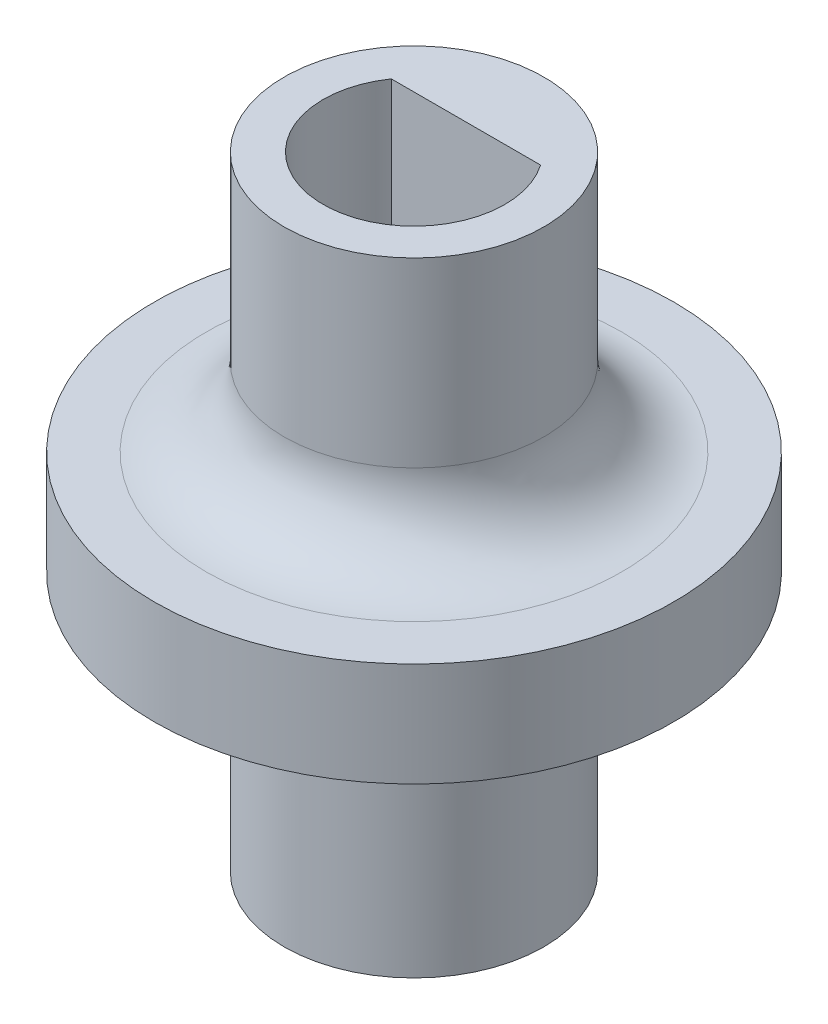
ISO-10303-21;
HEADER;
FILE_DESCRIPTION(('STEP AP214'),'2;1');
FILE_NAME('part.step','',(''),(''),'','','');
FILE_SCHEMA(('AUTOMOTIVE_DESIGN { 1 0 10303 214 1 1 1 1 }'));
ENDSEC;
DATA;
#1=APPLICATION_CONTEXT('core data for automotive mechanical design processes');
#2=APPLICATION_PROTOCOL_DEFINITION('international standard','automotive_design',2000,#1);
#3=PRODUCT_CONTEXT('',#1,'mechanical');
#4=PRODUCT('Part','Part','',(#3));
#5=PRODUCT_RELATED_PRODUCT_CATEGORY('part','',(#4));
#6=PRODUCT_DEFINITION_FORMATION('','',#4);
#7=PRODUCT_DEFINITION_CONTEXT('part definition',#1,'design');
#8=PRODUCT_DEFINITION('design','',#6,#7);
#9=PRODUCT_DEFINITION_SHAPE('','',#8);
#10=(LENGTH_UNIT() NAMED_UNIT(*) SI_UNIT(.MILLI.,.METRE.));
#11=(NAMED_UNIT(*) PLANE_ANGLE_UNIT() SI_UNIT($,.RADIAN.));
#12=(NAMED_UNIT(*) SI_UNIT($,.STERADIAN.) SOLID_ANGLE_UNIT());
#13=UNCERTAINTY_MEASURE_WITH_UNIT(LENGTH_MEASURE(1.E-05),#10,'distance_accuracy_value','');
#14=(GEOMETRIC_REPRESENTATION_CONTEXT(3) GLOBAL_UNCERTAINTY_ASSIGNED_CONTEXT((#13)) GLOBAL_UNIT_ASSIGNED_CONTEXT((#10,
#11,#12)) REPRESENTATION_CONTEXT('',''));
#15=CARTESIAN_POINT('',(0.,0.,0.));
#16=DIRECTION('',(0.,0.,1.));
#17=DIRECTION('',(1.,0.,0.));
#18=AXIS2_PLACEMENT_3D('',#15,#16,#17);
#19=CARTESIAN_POINT('',(0.,2.,0.));
#20=DIRECTION('',(0.,-1.,0.));
#21=DIRECTION('',(0.,0.,-1.));
#22=AXIS2_PLACEMENT_3D('',#19,#20,#21);
#23=CYLINDRICAL_SURFACE('',#22,10.);
#24=CARTESIAN_POINT('',(0.,2.,0.));
#25=DIRECTION('',(0.,1.,0.));
#26=DIRECTION('',(0.,0.,1.));
#27=AXIS2_PLACEMENT_3D('',#24,#25,#26);
#28=CIRCLE('',#27,10.);
#29=CARTESIAN_POINT('',(0.,2.,10.));
#30=VERTEX_POINT('',#29);
#31=EDGE_CURVE('E147',#30,#30,#28,.T.);
#32=ORIENTED_EDGE('',*,*,#31,.F.);
#33=EDGE_LOOP('',(#32));
#34=FACE_BOUND('',#33,.T.);
#35=CARTESIAN_POINT('',(0.,-2.,0.));
#36=DIRECTION('',(0.,1.,0.));
#37=DIRECTION('',(0.,0.,1.));
#38=AXIS2_PLACEMENT_3D('',#35,#36,#37);
#39=CIRCLE('',#38,10.);
#40=CARTESIAN_POINT('',(0.,-2.,10.));
#41=VERTEX_POINT('',#40);
#42=EDGE_CURVE('E146',#41,#41,#39,.T.);
#43=ORIENTED_EDGE('',*,*,#42,.T.);
#44=EDGE_LOOP('',(#43));
#45=FACE_BOUND('',#44,.T.);
#46=ADVANCED_FACE('F35',(#34,#45),#23,.T.);
#47=CARTESIAN_POINT('',(0.,2.,0.));
#48=DIRECTION('',(0.,1.,0.));
#49=DIRECTION('',(0.,0.,1.));
#50=AXIS2_PLACEMENT_3D('',#47,#48,#49);
#51=PLANE('',#50);
#52=CARTESIAN_POINT('',(0.,2.,0.));
#53=DIRECTION('',(0.,1.,0.));
#54=DIRECTION('',(0.,0.,1.));
#55=AXIS2_PLACEMENT_3D('',#52,#53,#54);
#56=CIRCLE('',#55,8.);
#57=CARTESIAN_POINT('',(0.,2.,8.));
#58=VERTEX_POINT('',#57);
#59=EDGE_CURVE('E11',#58,#58,#56,.F.);
#60=ORIENTED_EDGE('',*,*,#59,.T.);
#61=EDGE_LOOP('',(#60));
#62=FACE_BOUND('',#61,.T.);
#63=ORIENTED_EDGE('',*,*,#31,.T.);
#64=EDGE_LOOP('',(#63));
#65=FACE_BOUND('',#64,.T.);
#66=ADVANCED_FACE('F176',(#62,#65),#51,.T.);
#67=CARTESIAN_POINT('',(0.,-2.,0.));
#68=DIRECTION('',(0.,1.,0.));
#69=DIRECTION('',(0.,0.,1.));
#70=AXIS2_PLACEMENT_3D('',#67,#68,#69);
#71=PLANE('',#70);
#72=CARTESIAN_POINT('',(0.,-2.,0.));
#73=DIRECTION('',(0.,1.,0.));
#74=DIRECTION('',(0.,0.,1.));
#75=AXIS2_PLACEMENT_3D('',#72,#73,#74);
#76=CIRCLE('',#75,8.);
#77=CARTESIAN_POINT('',(0.,-2.,8.));
#78=VERTEX_POINT('',#77);
#79=EDGE_CURVE('E155',#78,#78,#76,.T.);
#80=ORIENTED_EDGE('',*,*,#79,.T.);
#81=EDGE_LOOP('',(#80));
#82=FACE_BOUND('',#81,.T.);
#83=ORIENTED_EDGE('',*,*,#42,.F.);
#84=EDGE_LOOP('',(#83));
#85=FACE_BOUND('',#84,.T.);
#86=ADVANCED_FACE('F182',(#82,#85),#71,.F.);
#87=CARTESIAN_POINT('',(0.,12.,0.));
#88=DIRECTION('',(0.,-1.,0.));
#89=DIRECTION('',(0.,0.,-1.));
#90=AXIS2_PLACEMENT_3D('',#87,#88,#89);
#91=CYLINDRICAL_SURFACE('',#90,5.);
#92=CARTESIAN_POINT('',(0.,5.,0.));
#93=DIRECTION('',(0.,1.,0.));
#94=DIRECTION('',(0.,0.,1.));
#95=AXIS2_PLACEMENT_3D('',#92,#93,#94);
#96=CIRCLE('',#95,5.);
#97=CARTESIAN_POINT('',(0.,5.,5.));
#98=VERTEX_POINT('',#97);
#99=EDGE_CURVE('E43',#98,#98,#96,.T.);
#100=ORIENTED_EDGE('',*,*,#99,.T.);
#101=EDGE_LOOP('',(#100));
#102=FACE_BOUND('',#101,.T.);
#103=CARTESIAN_POINT('',(0.,12.,0.));
#104=DIRECTION('',(0.,1.,0.));
#105=DIRECTION('',(0.,0.,1.));
#106=AXIS2_PLACEMENT_3D('',#103,#104,#105);
#107=CIRCLE('',#106,5.);
#108=CARTESIAN_POINT('',(0.,12.,5.));
#109=VERTEX_POINT('',#108);
#110=EDGE_CURVE('E142',#109,#109,#107,.T.);
#111=ORIENTED_EDGE('',*,*,#110,.F.);
#112=EDGE_LOOP('',(#111));
#113=FACE_BOUND('',#112,.T.);
#114=ADVANCED_FACE('F160',(#102,#113),#91,.T.);
#115=CARTESIAN_POINT('',(0.,12.,0.));
#116=DIRECTION('',(0.,1.,0.));
#117=DIRECTION('',(0.,0.,1.));
#118=AXIS2_PLACEMENT_3D('',#115,#116,#117);
#119=PLANE('',#118);
#120=CARTESIAN_POINT('',(0.,12.,0.));
#121=DIRECTION('',(0.,1.,0.));
#122=DIRECTION('',(0.,0.,1.));
#123=AXIS2_PLACEMENT_3D('',#120,#121,#122);
#124=CIRCLE('',#123,3.5);
#125=CARTESIAN_POINT('',(-2.87228132326901,12.,-2.));
#126=VERTEX_POINT('',#125);
#127=CARTESIAN_POINT('',(2.87228132326901,12.,-2.));
#128=VERTEX_POINT('',#127);
#129=EDGE_CURVE('E58',#126,#128,#124,.T.);
#130=ORIENTED_EDGE('',*,*,#129,.F.);
#131=DIRECTION('',(-1.,0.,0.));
#132=VECTOR('',#131,1.);
#133=CARTESIAN_POINT('',(-2.87228132326901,12.,-2.));
#134=LINE('',#133,#132);
#135=EDGE_CURVE('E133',#128,#126,#134,.T.);
#136=ORIENTED_EDGE('',*,*,#135,.F.);
#137=EDGE_LOOP('',(#130,#136));
#138=FACE_BOUND('',#137,.T.);
#139=ORIENTED_EDGE('',*,*,#110,.T.);
#140=EDGE_LOOP('',(#139));
#141=FACE_BOUND('',#140,.T.);
#142=ADVANCED_FACE('F193',(#138,#141),#119,.T.);
#143=CARTESIAN_POINT('',(0.,4.,0.));
#144=DIRECTION('',(0.,1.,0.));
#145=DIRECTION('',(0.,0.,1.));
#146=AXIS2_PLACEMENT_3D('',#143,#144,#145);
#147=CYLINDRICAL_SURFACE('',#146,3.5);
#148=ORIENTED_EDGE('',*,*,#129,.T.);
#149=DIRECTION('',(0.,1.,0.));
#150=VECTOR('',#149,1.);
#151=CARTESIAN_POINT('',(2.87228132326901,4.,-2.));
#152=LINE('',#151,#150);
#153=CARTESIAN_POINT('',(2.87228132326901,4.,-2.));
#154=VERTEX_POINT('',#153);
#155=EDGE_CURVE('E136',#154,#128,#152,.T.);
#156=ORIENTED_EDGE('',*,*,#155,.F.);
#157=CARTESIAN_POINT('',(0.,4.,0.));
#158=DIRECTION('',(0.,1.,0.));
#159=DIRECTION('',(0.,0.,1.));
#160=AXIS2_PLACEMENT_3D('',#157,#158,#159);
#161=CIRCLE('',#160,3.5);
#162=CARTESIAN_POINT('',(-2.87228132326901,4.,-2.));
#163=VERTEX_POINT('',#162);
#164=EDGE_CURVE('E129',#163,#154,#161,.T.);
#165=ORIENTED_EDGE('',*,*,#164,.F.);
#166=DIRECTION('',(0.,1.,0.));
#167=VECTOR('',#166,1.);
#168=CARTESIAN_POINT('',(-2.87228132326901,4.,-2.));
#169=LINE('',#168,#167);
#170=EDGE_CURVE('E140',#163,#126,#169,.T.);
#171=ORIENTED_EDGE('',*,*,#170,.T.);
#172=EDGE_LOOP('',(#148,#156,#165,#171));
#173=FACE_BOUND('',#172,.T.);
#174=ADVANCED_FACE('F196',(#173),#147,.F.);
#175=CARTESIAN_POINT('',(-2.87228132326901,4.,-2.));
#176=DIRECTION('',(0.,0.,-1.));
#177=DIRECTION('',(-1.,0.,0.));
#178=AXIS2_PLACEMENT_3D('',#175,#176,#177);
#179=PLANE('',#178);
#180=ORIENTED_EDGE('',*,*,#135,.T.);
#181=ORIENTED_EDGE('',*,*,#170,.F.);
#182=DIRECTION('',(-1.,0.,0.));
#183=VECTOR('',#182,1.);
#184=CARTESIAN_POINT('',(-2.87228132326901,4.,-2.));
#185=LINE('',#184,#183);
#186=EDGE_CURVE('E132',#154,#163,#185,.T.);
#187=ORIENTED_EDGE('',*,*,#186,.F.);
#188=ORIENTED_EDGE('',*,*,#155,.T.);
#189=EDGE_LOOP('',(#180,#181,#187,#188));
#190=FACE_BOUND('',#189,.T.);
#191=ADVANCED_FACE('F200',(#190),#179,.F.);
#192=CARTESIAN_POINT('',(0.,4.,0.));
#193=DIRECTION('',(0.,1.,0.));
#194=DIRECTION('',(0.,0.,1.));
#195=AXIS2_PLACEMENT_3D('',#192,#193,#194);
#196=PLANE('',#195);
#197=ORIENTED_EDGE('',*,*,#164,.T.);
#198=ORIENTED_EDGE('',*,*,#186,.T.);
#199=EDGE_LOOP('',(#197,#198));
#200=FACE_BOUND('',#199,.T.);
#201=ADVANCED_FACE('F203',(#200),#196,.T.);
#202=CARTESIAN_POINT('',(0.,-12.,0.));
#203=DIRECTION('',(0.,1.,0.));
#204=DIRECTION('',(0.,0.,1.));
#205=AXIS2_PLACEMENT_3D('',#202,#203,#204);
#206=CYLINDRICAL_SURFACE('',#205,5.);
#207=CARTESIAN_POINT('',(0.,-5.,0.));
#208=DIRECTION('',(0.,1.,0.));
#209=DIRECTION('',(0.,0.,1.));
#210=AXIS2_PLACEMENT_3D('',#207,#208,#209);
#211=CIRCLE('',#210,5.);
#212=CARTESIAN_POINT('',(0.,-5.,5.));
#213=VERTEX_POINT('',#212);
#214=EDGE_CURVE('E150',#213,#213,#211,.F.);
#215=ORIENTED_EDGE('',*,*,#214,.T.);
#216=EDGE_LOOP('',(#215));
#217=FACE_BOUND('',#216,.T.);
#218=CARTESIAN_POINT('',(0.,-12.,0.));
#219=DIRECTION('',(0.,-1.,0.));
#220=DIRECTION('',(0.,0.,-1.));
#221=AXIS2_PLACEMENT_3D('',#218,#219,#220);
#222=CIRCLE('',#221,5.);
#223=CARTESIAN_POINT('',(0.,-12.,-5.));
#224=VERTEX_POINT('',#223);
#225=EDGE_CURVE('E123',#224,#224,#222,.T.);
#226=ORIENTED_EDGE('',*,*,#225,.F.);
#227=EDGE_LOOP('',(#226));
#228=FACE_BOUND('',#227,.T.);
#229=ADVANCED_FACE('F207',(#217,#228),#206,.T.);
#230=CARTESIAN_POINT('',(0.,-12.,0.));
#231=DIRECTION('',(0.,-1.,0.));
#232=DIRECTION('',(0.,0.,-1.));
#233=AXIS2_PLACEMENT_3D('',#230,#231,#232);
#234=PLANE('',#233);
#235=CARTESIAN_POINT('',(0.,-12.,0.));
#236=DIRECTION('',(0.,-1.,0.));
#237=DIRECTION('',(0.,0.,-1.));
#238=AXIS2_PLACEMENT_3D('',#235,#236,#237);
#239=CIRCLE('',#238,3.25);
#240=CARTESIAN_POINT('',(-2.19146070008111,-12.,2.4));
#241=VERTEX_POINT('',#240);
#242=CARTESIAN_POINT('',(-2.19146070008111,-12.,-2.4));
#243=VERTEX_POINT('',#242);
#244=EDGE_CURVE('E50',#241,#243,#239,.T.);
#245=ORIENTED_EDGE('',*,*,#244,.F.);
#246=DIRECTION('',(-1.,0.,0.));
#247=VECTOR('',#246,1.);
#248=CARTESIAN_POINT('',(-2.19146070008111,-12.,2.4));
#249=LINE('',#248,#247);
#250=CARTESIAN_POINT('',(2.19146070008111,-12.,2.4));
#251=VERTEX_POINT('',#250);
#252=EDGE_CURVE('E108',#251,#241,#249,.T.);
#253=ORIENTED_EDGE('',*,*,#252,.F.);
#254=CARTESIAN_POINT('',(0.,-12.,0.));
#255=DIRECTION('',(0.,-1.,0.));
#256=DIRECTION('',(0.,0.,-1.));
#257=AXIS2_PLACEMENT_3D('',#254,#255,#256);
#258=CIRCLE('',#257,3.25);
#259=CARTESIAN_POINT('',(2.19146070008111,-12.,-2.4));
#260=VERTEX_POINT('',#259);
#261=EDGE_CURVE('E111',#260,#251,#258,.T.);
#262=ORIENTED_EDGE('',*,*,#261,.F.);
#263=DIRECTION('',(1.,0.,0.));
#264=VECTOR('',#263,1.);
#265=CARTESIAN_POINT('',(-2.19146070008111,-12.,-2.4));
#266=LINE('',#265,#264);
#267=EDGE_CURVE('E117',#243,#260,#266,.T.);
#268=ORIENTED_EDGE('',*,*,#267,.F.);
#269=EDGE_LOOP('',(#245,#253,#262,#268));
#270=FACE_BOUND('',#269,.T.);
#271=ORIENTED_EDGE('',*,*,#225,.T.);
#272=EDGE_LOOP('',(#271));
#273=FACE_BOUND('',#272,.T.);
#274=ADVANCED_FACE('F172',(#270,#273),#234,.T.);
#275=CARTESIAN_POINT('',(0.,-5.,0.));
#276=DIRECTION('',(0.,1.,0.));
#277=DIRECTION('',(0.,0.,1.));
#278=AXIS2_PLACEMENT_3D('',#275,#276,#277);
#279=TOROIDAL_SURFACE('',#278,8.,3.);
#280=ORIENTED_EDGE('',*,*,#79,.F.);
#281=EDGE_LOOP('',(#280));
#282=FACE_BOUND('',#281,.T.);
#283=ORIENTED_EDGE('',*,*,#214,.F.);
#284=EDGE_LOOP('',(#283));
#285=FACE_BOUND('',#284,.T.);
#286=ADVANCED_FACE('F164',(#282,#285),#279,.F.);
#287=CARTESIAN_POINT('',(0.,5.,0.));
#288=DIRECTION('',(0.,1.,0.));
#289=DIRECTION('',(0.,0.,1.));
#290=AXIS2_PLACEMENT_3D('',#287,#288,#289);
#291=TOROIDAL_SURFACE('',#290,8.,3.);
#292=ORIENTED_EDGE('',*,*,#59,.F.);
#293=EDGE_LOOP('',(#292));
#294=FACE_BOUND('',#293,.T.);
#295=ORIENTED_EDGE('',*,*,#99,.F.);
#296=EDGE_LOOP('',(#295));
#297=FACE_BOUND('',#296,.T.);
#298=ADVANCED_FACE('F37',(#294,#297),#291,.F.);
#299=CARTESIAN_POINT('',(0.,-3.,0.));
#300=DIRECTION('',(0.,-1.,0.));
#301=DIRECTION('',(0.,0.,-1.));
#302=AXIS2_PLACEMENT_3D('',#299,#300,#301);
#303=CYLINDRICAL_SURFACE('',#302,3.25);
#304=ORIENTED_EDGE('',*,*,#244,.T.);
#305=DIRECTION('',(0.,-1.,0.));
#306=VECTOR('',#305,1.);
#307=CARTESIAN_POINT('',(-2.19146070008111,-3.,-2.4));
#308=LINE('',#307,#306);
#309=CARTESIAN_POINT('',(-2.19146070008111,-3.,-2.4));
#310=VERTEX_POINT('',#309);
#311=EDGE_CURVE('E86',#310,#243,#308,.T.);
#312=ORIENTED_EDGE('',*,*,#311,.F.);
#313=CARTESIAN_POINT('',(0.,-3.,0.));
#314=DIRECTION('',(0.,-1.,0.));
#315=DIRECTION('',(0.,0.,-1.));
#316=AXIS2_PLACEMENT_3D('',#313,#314,#315);
#317=CIRCLE('',#316,3.25);
#318=CARTESIAN_POINT('',(-2.19146070008111,-3.,2.4));
#319=VERTEX_POINT('',#318);
#320=EDGE_CURVE('E90',#319,#310,#317,.T.);
#321=ORIENTED_EDGE('',*,*,#320,.F.);
#322=DIRECTION('',(0.,-1.,0.));
#323=VECTOR('',#322,1.);
#324=CARTESIAN_POINT('',(-2.19146070008111,-3.,2.4));
#325=LINE('',#324,#323);
#326=EDGE_CURVE('E121',#319,#241,#325,.T.);
#327=ORIENTED_EDGE('',*,*,#326,.T.);
#328=EDGE_LOOP('',(#304,#312,#321,#327));
#329=FACE_BOUND('',#328,.T.);
#330=ADVANCED_FACE('F88',(#329),#303,.F.);
#331=CARTESIAN_POINT('',(-2.19146070008111,-3.,2.4));
#332=DIRECTION('',(0.,0.,1.));
#333=DIRECTION('',(1.,0.,0.));
#334=AXIS2_PLACEMENT_3D('',#331,#332,#333);
#335=PLANE('',#334);
#336=ORIENTED_EDGE('',*,*,#252,.T.);
#337=ORIENTED_EDGE('',*,*,#326,.F.);
#338=DIRECTION('',(-1.,0.,0.));
#339=VECTOR('',#338,1.);
#340=CARTESIAN_POINT('',(-2.19146070008111,-3.,2.4));
#341=LINE('',#340,#339);
#342=CARTESIAN_POINT('',(2.19146070008111,-3.,2.4));
#343=VERTEX_POINT('',#342);
#344=EDGE_CURVE('E96',#343,#319,#341,.T.);
#345=ORIENTED_EDGE('',*,*,#344,.F.);
#346=DIRECTION('',(0.,-1.,0.));
#347=VECTOR('',#346,1.);
#348=CARTESIAN_POINT('',(2.19146070008111,-3.,2.4));
#349=LINE('',#348,#347);
#350=EDGE_CURVE('E124',#343,#251,#349,.T.);
#351=ORIENTED_EDGE('',*,*,#350,.T.);
#352=EDGE_LOOP('',(#336,#337,#345,#351));
#353=FACE_BOUND('',#352,.T.);
#354=ADVANCED_FACE('F170',(#353),#335,.F.);
#355=CARTESIAN_POINT('',(0.,-3.,0.));
#356=DIRECTION('',(0.,-1.,0.));
#357=DIRECTION('',(0.,0.,-1.));
#358=AXIS2_PLACEMENT_3D('',#355,#356,#357);
#359=CYLINDRICAL_SURFACE('',#358,3.25);
#360=ORIENTED_EDGE('',*,*,#261,.T.);
#361=ORIENTED_EDGE('',*,*,#350,.F.);
#362=CARTESIAN_POINT('',(0.,-3.,0.));
#363=DIRECTION('',(0.,-1.,0.));
#364=DIRECTION('',(0.,0.,-1.));
#365=AXIS2_PLACEMENT_3D('',#362,#363,#364);
#366=CIRCLE('',#365,3.25);
#367=CARTESIAN_POINT('',(2.19146070008111,-3.,-2.4));
#368=VERTEX_POINT('',#367);
#369=EDGE_CURVE('E104',#368,#343,#366,.T.);
#370=ORIENTED_EDGE('',*,*,#369,.F.);
#371=DIRECTION('',(0.,-1.,0.));
#372=VECTOR('',#371,1.);
#373=CARTESIAN_POINT('',(2.19146070008111,-3.,-2.4));
#374=LINE('',#373,#372);
#375=EDGE_CURVE('E95',#368,#260,#374,.T.);
#376=ORIENTED_EDGE('',*,*,#375,.T.);
#377=EDGE_LOOP('',(#360,#361,#370,#376));
#378=FACE_BOUND('',#377,.T.);
#379=ADVANCED_FACE('F217',(#378),#359,.F.);
#380=CARTESIAN_POINT('',(-2.19146070008111,-3.,-2.4));
#381=DIRECTION('',(0.,0.,-1.));
#382=DIRECTION('',(-1.,0.,0.));
#383=AXIS2_PLACEMENT_3D('',#380,#381,#382);
#384=PLANE('',#383);
#385=ORIENTED_EDGE('',*,*,#267,.T.);
#386=ORIENTED_EDGE('',*,*,#375,.F.);
#387=DIRECTION('',(1.,0.,0.));
#388=VECTOR('',#387,1.);
#389=CARTESIAN_POINT('',(-2.19146070008111,-3.,-2.4));
#390=LINE('',#389,#388);
#391=EDGE_CURVE('E99',#310,#368,#390,.T.);
#392=ORIENTED_EDGE('',*,*,#391,.F.);
#393=ORIENTED_EDGE('',*,*,#311,.T.);
#394=EDGE_LOOP('',(#385,#386,#392,#393));
#395=FACE_BOUND('',#394,.T.);
#396=ADVANCED_FACE('F100',(#395),#384,.F.);
#397=CARTESIAN_POINT('',(0.,-3.,0.));
#398=DIRECTION('',(0.,-1.,0.));
#399=DIRECTION('',(0.,0.,-1.));
#400=AXIS2_PLACEMENT_3D('',#397,#398,#399);
#401=PLANE('',#400);
#402=ORIENTED_EDGE('',*,*,#320,.T.);
#403=ORIENTED_EDGE('',*,*,#391,.T.);
#404=ORIENTED_EDGE('',*,*,#369,.T.);
#405=ORIENTED_EDGE('',*,*,#344,.T.);
#406=EDGE_LOOP('',(#402,#403,#404,#405));
#407=FACE_BOUND('',#406,.T.);
#408=ADVANCED_FACE('F106',(#407),#401,.T.);
#409=CLOSED_SHELL('',(#46,#66,#86,#114,#142,#174,#191,#201,#229,#274,#286,#298,#330,#354,#379,
#396,#408));
#410=MANIFOLD_SOLID_BREP('B2',#409);
#411=ADVANCED_BREP_SHAPE_REPRESENTATION('',(#18,#410),#14);
#412=SHAPE_DEFINITION_REPRESENTATION(#9,#411);
ENDSEC;
END-ISO-10303-21;
